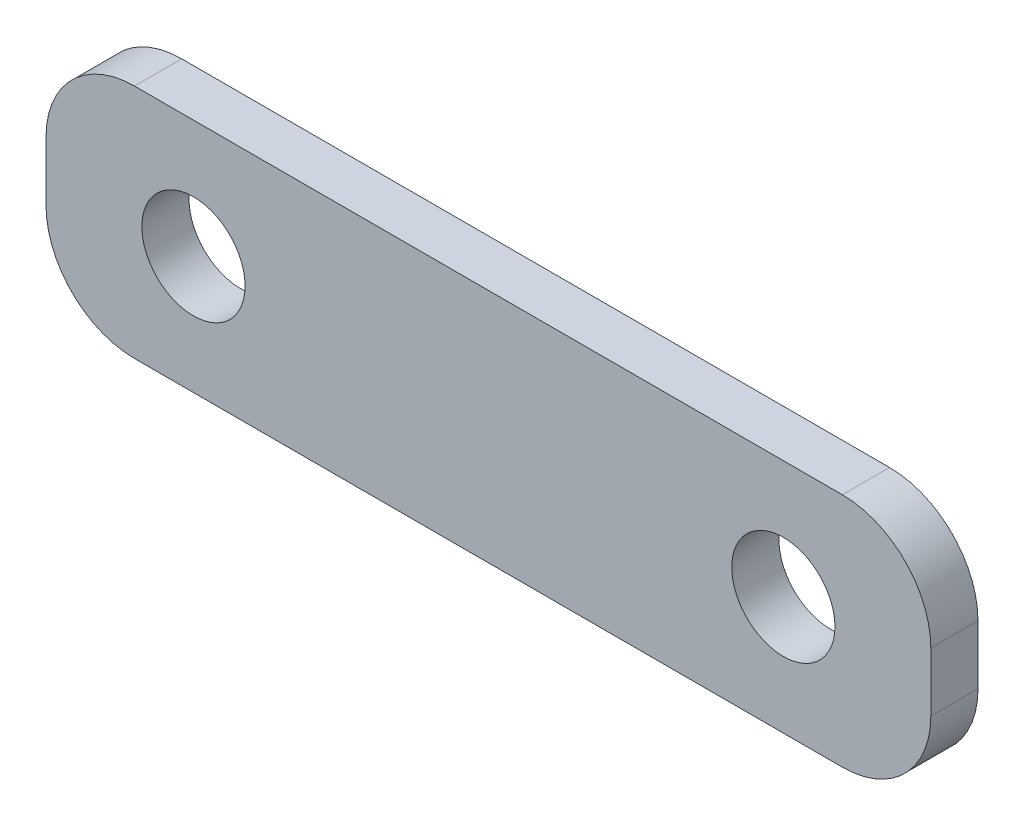
ISO-10303-21;
HEADER;
FILE_DESCRIPTION(('STEP AP214'),'2;1');
FILE_NAME('part.step','',(''),(''),'','','');
FILE_SCHEMA(('AUTOMOTIVE_DESIGN { 1 0 10303 214 1 1 1 1 }'));
ENDSEC;
DATA;
#1=APPLICATION_CONTEXT('core data for automotive mechanical design processes');
#2=APPLICATION_PROTOCOL_DEFINITION('international standard','automotive_design',2000,#1);
#3=PRODUCT_CONTEXT('',#1,'mechanical');
#4=PRODUCT('Part','Part','',(#3));
#5=PRODUCT_RELATED_PRODUCT_CATEGORY('part','',(#4));
#6=PRODUCT_DEFINITION_FORMATION('','',#4);
#7=PRODUCT_DEFINITION_CONTEXT('part definition',#1,'design');
#8=PRODUCT_DEFINITION('design','',#6,#7);
#9=PRODUCT_DEFINITION_SHAPE('','',#8);
#10=(LENGTH_UNIT() NAMED_UNIT(*) SI_UNIT(.MILLI.,.METRE.));
#11=(NAMED_UNIT(*) PLANE_ANGLE_UNIT() SI_UNIT($,.RADIAN.));
#12=(NAMED_UNIT(*) SI_UNIT($,.STERADIAN.) SOLID_ANGLE_UNIT());
#13=UNCERTAINTY_MEASURE_WITH_UNIT(LENGTH_MEASURE(1.E-05),#10,'distance_accuracy_value','');
#14=(GEOMETRIC_REPRESENTATION_CONTEXT(3) GLOBAL_UNCERTAINTY_ASSIGNED_CONTEXT((#13)) GLOBAL_UNIT_ASSIGNED_CONTEXT((#10,
#11,#12)) REPRESENTATION_CONTEXT('',''));
#15=CARTESIAN_POINT('',(0.,0.,0.));
#16=DIRECTION('',(0.,0.,1.));
#17=DIRECTION('',(1.,0.,0.));
#18=AXIS2_PLACEMENT_3D('',#15,#16,#17);
#19=CARTESIAN_POINT('',(150.,0.,4.));
#20=DIRECTION('',(0.,1.,0.));
#21=DIRECTION('',(-1.,0.,0.));
#22=AXIS2_PLACEMENT_3D('',#19,#20,#21);
#23=PLANE('',#22);
#24=DIRECTION('',(1.,0.,0.));
#25=VECTOR('',#24,1.);
#26=CARTESIAN_POINT('',(150.,0.,-4.));
#27=LINE('',#26,#25);
#28=CARTESIAN_POINT('',(15.,0.,-4.));
#29=VERTEX_POINT('',#28);
#30=CARTESIAN_POINT('',(135.,0.,-4.));
#31=VERTEX_POINT('',#30);
#32=EDGE_CURVE('E135',#29,#31,#27,.T.);
#33=ORIENTED_EDGE('',*,*,#32,.T.);
#34=DIRECTION('',(0.,0.,-1.));
#35=VECTOR('',#34,1.);
#36=CARTESIAN_POINT('',(135.,0.,4.));
#37=LINE('',#36,#35);
#38=CARTESIAN_POINT('',(135.,0.,4.));
#39=VERTEX_POINT('',#38);
#40=EDGE_CURVE('E110',#31,#39,#37,.F.);
#41=ORIENTED_EDGE('',*,*,#40,.T.);
#42=DIRECTION('',(1.,0.,0.));
#43=VECTOR('',#42,1.);
#44=CARTESIAN_POINT('',(150.,0.,4.));
#45=LINE('',#44,#43);
#46=CARTESIAN_POINT('',(15.,0.,4.));
#47=VERTEX_POINT('',#46);
#48=EDGE_CURVE('E148',#47,#39,#45,.T.);
#49=ORIENTED_EDGE('',*,*,#48,.F.);
#50=DIRECTION('',(0.,0.,-1.));
#51=VECTOR('',#50,1.);
#52=CARTESIAN_POINT('',(15.,0.,4.));
#53=LINE('',#52,#51);
#54=EDGE_CURVE('E116',#47,#29,#53,.T.);
#55=ORIENTED_EDGE('',*,*,#54,.T.);
#56=EDGE_LOOP('',(#33,#41,#49,#55));
#57=FACE_BOUND('',#56,.T.);
#58=ADVANCED_FACE('F39',(#57),#23,.F.);
#59=CARTESIAN_POINT('',(150.,40.,4.));
#60=DIRECTION('',(-1.,0.,0.));
#61=DIRECTION('',(0.,0.,1.));
#62=AXIS2_PLACEMENT_3D('',#59,#60,#61);
#63=PLANE('',#62);
#64=DIRECTION('',(0.,1.,0.));
#65=VECTOR('',#64,1.);
#66=CARTESIAN_POINT('',(150.,40.,4.));
#67=LINE('',#66,#65);
#68=CARTESIAN_POINT('',(150.,15.,4.));
#69=VERTEX_POINT('',#68);
#70=CARTESIAN_POINT('',(150.,25.,4.));
#71=VERTEX_POINT('',#70);
#72=EDGE_CURVE('E126',#69,#71,#67,.T.);
#73=ORIENTED_EDGE('',*,*,#72,.F.);
#74=DIRECTION('',(0.,0.,-1.));
#75=VECTOR('',#74,1.);
#76=CARTESIAN_POINT('',(150.,15.,4.));
#77=LINE('',#76,#75);
#78=CARTESIAN_POINT('',(150.,15.,-4.));
#79=VERTEX_POINT('',#78);
#80=EDGE_CURVE('E109',#69,#79,#77,.T.);
#81=ORIENTED_EDGE('',*,*,#80,.T.);
#82=DIRECTION('',(0.,1.,0.));
#83=VECTOR('',#82,1.);
#84=CARTESIAN_POINT('',(150.,40.,-4.));
#85=LINE('',#84,#83);
#86=CARTESIAN_POINT('',(150.,25.,-4.));
#87=VERTEX_POINT('',#86);
#88=EDGE_CURVE('E123',#79,#87,#85,.T.);
#89=ORIENTED_EDGE('',*,*,#88,.T.);
#90=DIRECTION('',(0.,0.,-1.));
#91=VECTOR('',#90,1.);
#92=CARTESIAN_POINT('',(150.,25.,4.));
#93=LINE('',#92,#91);
#94=EDGE_CURVE('E129',#87,#71,#93,.F.);
#95=ORIENTED_EDGE('',*,*,#94,.T.);
#96=EDGE_LOOP('',(#73,#81,#89,#95));
#97=FACE_BOUND('',#96,.T.);
#98=ADVANCED_FACE('F122',(#97),#63,.F.);
#99=CARTESIAN_POINT('',(0.,40.,4.));
#100=DIRECTION('',(0.,-1.,0.));
#101=DIRECTION('',(0.,0.,-1.));
#102=AXIS2_PLACEMENT_3D('',#99,#100,#101);
#103=PLANE('',#102);
#104=DIRECTION('',(-1.,0.,0.));
#105=VECTOR('',#104,1.);
#106=CARTESIAN_POINT('',(0.,40.,4.));
#107=LINE('',#106,#105);
#108=CARTESIAN_POINT('',(135.,40.,4.));
#109=VERTEX_POINT('',#108);
#110=CARTESIAN_POINT('',(15.,40.,4.));
#111=VERTEX_POINT('',#110);
#112=EDGE_CURVE('E197',#109,#111,#107,.T.);
#113=ORIENTED_EDGE('',*,*,#112,.F.);
#114=DIRECTION('',(0.,0.,-1.));
#115=VECTOR('',#114,1.);
#116=CARTESIAN_POINT('',(135.,40.,4.));
#117=LINE('',#116,#115);
#118=CARTESIAN_POINT('',(135.,40.,-4.));
#119=VERTEX_POINT('',#118);
#120=EDGE_CURVE('E178',#109,#119,#117,.T.);
#121=ORIENTED_EDGE('',*,*,#120,.T.);
#122=DIRECTION('',(-1.,0.,0.));
#123=VECTOR('',#122,1.);
#124=CARTESIAN_POINT('',(0.,40.,-4.));
#125=LINE('',#124,#123);
#126=CARTESIAN_POINT('',(15.,40.,-4.));
#127=VERTEX_POINT('',#126);
#128=EDGE_CURVE('E134',#119,#127,#125,.T.);
#129=ORIENTED_EDGE('',*,*,#128,.T.);
#130=DIRECTION('',(0.,0.,-1.));
#131=VECTOR('',#130,1.);
#132=CARTESIAN_POINT('',(15.,40.,4.));
#133=LINE('',#132,#131);
#134=EDGE_CURVE('E175',#127,#111,#133,.F.);
#135=ORIENTED_EDGE('',*,*,#134,.T.);
#136=EDGE_LOOP('',(#113,#121,#129,#135));
#137=FACE_BOUND('',#136,.T.);
#138=ADVANCED_FACE('F214',(#137),#103,.F.);
#139=CARTESIAN_POINT('',(0.,0.,4.));
#140=DIRECTION('',(1.,0.,0.));
#141=DIRECTION('',(0.,0.,-1.));
#142=AXIS2_PLACEMENT_3D('',#139,#140,#141);
#143=PLANE('',#142);
#144=DIRECTION('',(0.,-1.,0.));
#145=VECTOR('',#144,1.);
#146=CARTESIAN_POINT('',(0.,0.,-4.));
#147=LINE('',#146,#145);
#148=CARTESIAN_POINT('',(0.,25.,-4.));
#149=VERTEX_POINT('',#148);
#150=CARTESIAN_POINT('',(0.,15.,-4.));
#151=VERTEX_POINT('',#150);
#152=EDGE_CURVE('E140',#149,#151,#147,.T.);
#153=ORIENTED_EDGE('',*,*,#152,.T.);
#154=DIRECTION('',(0.,0.,-1.));
#155=VECTOR('',#154,1.);
#156=CARTESIAN_POINT('',(0.,15.,4.));
#157=LINE('',#156,#155);
#158=CARTESIAN_POINT('',(0.,15.,4.));
#159=VERTEX_POINT('',#158);
#160=EDGE_CURVE('E11',#151,#159,#157,.F.);
#161=ORIENTED_EDGE('',*,*,#160,.T.);
#162=DIRECTION('',(0.,-1.,0.));
#163=VECTOR('',#162,1.);
#164=CARTESIAN_POINT('',(0.,0.,4.));
#165=LINE('',#164,#163);
#166=CARTESIAN_POINT('',(0.,25.,4.));
#167=VERTEX_POINT('',#166);
#168=EDGE_CURVE('E150',#167,#159,#165,.T.);
#169=ORIENTED_EDGE('',*,*,#168,.F.);
#170=DIRECTION('',(0.,0.,-1.));
#171=VECTOR('',#170,1.);
#172=CARTESIAN_POINT('',(0.,25.,4.));
#173=LINE('',#172,#171);
#174=EDGE_CURVE('E48',#167,#149,#173,.T.);
#175=ORIENTED_EDGE('',*,*,#174,.T.);
#176=EDGE_LOOP('',(#153,#161,#169,#175));
#177=FACE_BOUND('',#176,.T.);
#178=ADVANCED_FACE('F185',(#177),#143,.F.);
#179=CARTESIAN_POINT('',(0.,0.,4.));
#180=DIRECTION('',(0.,0.,-1.));
#181=DIRECTION('',(-1.,0.,0.));
#182=AXIS2_PLACEMENT_3D('',#179,#180,#181);
#183=PLANE('',#182);
#184=CARTESIAN_POINT('',(25.,20.,4.));
#185=DIRECTION('',(0.,0.,1.));
#186=DIRECTION('',(1.,0.,0.));
#187=AXIS2_PLACEMENT_3D('',#184,#185,#186);
#188=CIRCLE('',#187,8.75);
#189=CARTESIAN_POINT('',(33.75,20.,4.));
#190=VERTEX_POINT('',#189);
#191=EDGE_CURVE('E310',#190,#190,#188,.T.);
#192=ORIENTED_EDGE('',*,*,#191,.F.);
#193=EDGE_LOOP('',(#192));
#194=FACE_BOUND('',#193,.T.);
#195=CARTESIAN_POINT('',(125.,20.,4.));
#196=DIRECTION('',(0.,0.,1.));
#197=DIRECTION('',(1.,0.,0.));
#198=AXIS2_PLACEMENT_3D('',#195,#196,#197);
#199=CIRCLE('',#198,8.75000000000001);
#200=CARTESIAN_POINT('',(133.75,20.,4.));
#201=VERTEX_POINT('',#200);
#202=EDGE_CURVE('E314',#201,#201,#199,.T.);
#203=ORIENTED_EDGE('',*,*,#202,.F.);
#204=EDGE_LOOP('',(#203));
#205=FACE_BOUND('',#204,.T.);
#206=ORIENTED_EDGE('',*,*,#48,.T.);
#207=CARTESIAN_POINT('',(135.,15.,4.));
#208=DIRECTION('',(0.,0.,-1.));
#209=DIRECTION('',(-1.,0.,0.));
#210=AXIS2_PLACEMENT_3D('',#207,#208,#209);
#211=CIRCLE('',#210,15.);
#212=EDGE_CURVE('E172',#39,#69,#211,.F.);
#213=ORIENTED_EDGE('',*,*,#212,.T.);
#214=ORIENTED_EDGE('',*,*,#72,.T.);
#215=CARTESIAN_POINT('',(135.,25.,4.));
#216=DIRECTION('',(0.,0.,-1.));
#217=DIRECTION('',(-1.,0.,0.));
#218=AXIS2_PLACEMENT_3D('',#215,#216,#217);
#219=CIRCLE('',#218,15.);
#220=EDGE_CURVE('E169',#71,#109,#219,.F.);
#221=ORIENTED_EDGE('',*,*,#220,.T.);
#222=ORIENTED_EDGE('',*,*,#112,.T.);
#223=CARTESIAN_POINT('',(15.,25.,4.));
#224=DIRECTION('',(0.,0.,-1.));
#225=DIRECTION('',(-1.,0.,0.));
#226=AXIS2_PLACEMENT_3D('',#223,#224,#225);
#227=CIRCLE('',#226,15.);
#228=EDGE_CURVE('E60',#111,#167,#227,.F.);
#229=ORIENTED_EDGE('',*,*,#228,.T.);
#230=ORIENTED_EDGE('',*,*,#168,.T.);
#231=CARTESIAN_POINT('',(15.,15.,4.));
#232=DIRECTION('',(0.,0.,-1.));
#233=DIRECTION('',(-1.,0.,0.));
#234=AXIS2_PLACEMENT_3D('',#231,#232,#233);
#235=CIRCLE('',#234,15.);
#236=EDGE_CURVE('E166',#159,#47,#235,.F.);
#237=ORIENTED_EDGE('',*,*,#236,.T.);
#238=EDGE_LOOP('',(#206,#213,#214,#221,#222,#229,#230,#237));
#239=FACE_BOUND('',#238,.T.);
#240=ADVANCED_FACE('F204',(#194,#205,#239),#183,.F.);
#241=CARTESIAN_POINT('',(0.,0.,-4.));
#242=DIRECTION('',(0.,0.,-1.));
#243=DIRECTION('',(-1.,0.,0.));
#244=AXIS2_PLACEMENT_3D('',#241,#242,#243);
#245=PLANE('',#244);
#246=CARTESIAN_POINT('',(25.,20.,-4.));
#247=DIRECTION('',(0.,0.,1.));
#248=DIRECTION('',(1.,0.,0.));
#249=AXIS2_PLACEMENT_3D('',#246,#247,#248);
#250=CIRCLE('',#249,8.75);
#251=CARTESIAN_POINT('',(33.75,20.,-4.));
#252=VERTEX_POINT('',#251);
#253=EDGE_CURVE('E308',#252,#252,#250,.T.);
#254=ORIENTED_EDGE('',*,*,#253,.T.);
#255=EDGE_LOOP('',(#254));
#256=FACE_BOUND('',#255,.T.);
#257=CARTESIAN_POINT('',(125.,20.,-4.));
#258=DIRECTION('',(0.,0.,1.));
#259=DIRECTION('',(1.,0.,0.));
#260=AXIS2_PLACEMENT_3D('',#257,#258,#259);
#261=CIRCLE('',#260,8.75000000000001);
#262=CARTESIAN_POINT('',(133.75,20.,-4.));
#263=VERTEX_POINT('',#262);
#264=EDGE_CURVE('E142',#263,#263,#261,.T.);
#265=ORIENTED_EDGE('',*,*,#264,.T.);
#266=EDGE_LOOP('',(#265));
#267=FACE_BOUND('',#266,.T.);
#268=ORIENTED_EDGE('',*,*,#88,.F.);
#269=CARTESIAN_POINT('',(135.,15.,-4.));
#270=DIRECTION('',(0.,0.,-1.));
#271=DIRECTION('',(-1.,0.,0.));
#272=AXIS2_PLACEMENT_3D('',#269,#270,#271);
#273=CIRCLE('',#272,15.);
#274=EDGE_CURVE('E105',#79,#31,#273,.T.);
#275=ORIENTED_EDGE('',*,*,#274,.T.);
#276=ORIENTED_EDGE('',*,*,#32,.F.);
#277=CARTESIAN_POINT('',(15.,15.,-4.));
#278=DIRECTION('',(0.,0.,-1.));
#279=DIRECTION('',(-1.,0.,0.));
#280=AXIS2_PLACEMENT_3D('',#277,#278,#279);
#281=CIRCLE('',#280,15.);
#282=EDGE_CURVE('E154',#29,#151,#281,.T.);
#283=ORIENTED_EDGE('',*,*,#282,.T.);
#284=ORIENTED_EDGE('',*,*,#152,.F.);
#285=CARTESIAN_POINT('',(15.,25.,-4.));
#286=DIRECTION('',(0.,0.,-1.));
#287=DIRECTION('',(-1.,0.,0.));
#288=AXIS2_PLACEMENT_3D('',#285,#286,#287);
#289=CIRCLE('',#288,15.);
#290=EDGE_CURVE('E128',#149,#127,#289,.T.);
#291=ORIENTED_EDGE('',*,*,#290,.T.);
#292=ORIENTED_EDGE('',*,*,#128,.F.);
#293=CARTESIAN_POINT('',(135.,25.,-4.));
#294=DIRECTION('',(0.,0.,-1.));
#295=DIRECTION('',(-1.,0.,0.));
#296=AXIS2_PLACEMENT_3D('',#293,#294,#295);
#297=CIRCLE('',#296,15.);
#298=EDGE_CURVE('E117',#119,#87,#297,.T.);
#299=ORIENTED_EDGE('',*,*,#298,.T.);
#300=EDGE_LOOP('',(#268,#275,#276,#283,#284,#291,#292,#299));
#301=FACE_BOUND('',#300,.T.);
#302=ADVANCED_FACE('F131',(#256,#267,#301),#245,.T.);
#303=CARTESIAN_POINT('',(135.,15.,4.));
#304=DIRECTION('',(0.,0.,-1.));
#305=DIRECTION('',(-1.,0.,0.));
#306=AXIS2_PLACEMENT_3D('',#303,#304,#305);
#307=CYLINDRICAL_SURFACE('',#306,15.);
#308=ORIENTED_EDGE('',*,*,#212,.F.);
#309=ORIENTED_EDGE('',*,*,#40,.F.);
#310=ORIENTED_EDGE('',*,*,#274,.F.);
#311=ORIENTED_EDGE('',*,*,#80,.F.);
#312=EDGE_LOOP('',(#308,#309,#310,#311));
#313=FACE_BOUND('',#312,.T.);
#314=ADVANCED_FACE('F108',(#313),#307,.T.);
#315=CARTESIAN_POINT('',(135.,25.,4.));
#316=DIRECTION('',(0.,0.,-1.));
#317=DIRECTION('',(-1.,0.,0.));
#318=AXIS2_PLACEMENT_3D('',#315,#316,#317);
#319=CYLINDRICAL_SURFACE('',#318,15.);
#320=ORIENTED_EDGE('',*,*,#220,.F.);
#321=ORIENTED_EDGE('',*,*,#94,.F.);
#322=ORIENTED_EDGE('',*,*,#298,.F.);
#323=ORIENTED_EDGE('',*,*,#120,.F.);
#324=EDGE_LOOP('',(#320,#321,#322,#323));
#325=FACE_BOUND('',#324,.T.);
#326=ADVANCED_FACE('F229',(#325),#319,.T.);
#327=CARTESIAN_POINT('',(15.,15.,4.));
#328=DIRECTION('',(0.,0.,-1.));
#329=DIRECTION('',(-1.,0.,0.));
#330=AXIS2_PLACEMENT_3D('',#327,#328,#329);
#331=CYLINDRICAL_SURFACE('',#330,15.);
#332=ORIENTED_EDGE('',*,*,#236,.F.);
#333=ORIENTED_EDGE('',*,*,#160,.F.);
#334=ORIENTED_EDGE('',*,*,#282,.F.);
#335=ORIENTED_EDGE('',*,*,#54,.F.);
#336=EDGE_LOOP('',(#332,#333,#334,#335));
#337=FACE_BOUND('',#336,.T.);
#338=ADVANCED_FACE('F190',(#337),#331,.T.);
#339=CARTESIAN_POINT('',(15.,25.,4.));
#340=DIRECTION('',(0.,0.,-1.));
#341=DIRECTION('',(-1.,0.,0.));
#342=AXIS2_PLACEMENT_3D('',#339,#340,#341);
#343=CYLINDRICAL_SURFACE('',#342,15.);
#344=ORIENTED_EDGE('',*,*,#228,.F.);
#345=ORIENTED_EDGE('',*,*,#134,.F.);
#346=ORIENTED_EDGE('',*,*,#290,.F.);
#347=ORIENTED_EDGE('',*,*,#174,.F.);
#348=EDGE_LOOP('',(#344,#345,#346,#347));
#349=FACE_BOUND('',#348,.T.);
#350=ADVANCED_FACE('F41',(#349),#343,.T.);
#351=CARTESIAN_POINT('',(125.,20.,4.));
#352=DIRECTION('',(0.,0.,1.));
#353=DIRECTION('',(1.,0.,0.));
#354=AXIS2_PLACEMENT_3D('',#351,#352,#353);
#355=CYLINDRICAL_SURFACE('',#354,8.75000000000001);
#356=ORIENTED_EDGE('',*,*,#264,.F.);
#357=EDGE_LOOP('',(#356));
#358=FACE_BOUND('',#357,.T.);
#359=ORIENTED_EDGE('',*,*,#202,.T.);
#360=EDGE_LOOP('',(#359));
#361=FACE_BOUND('',#360,.T.);
#362=ADVANCED_FACE('F236',(#358,#361),#355,.F.);
#363=CARTESIAN_POINT('',(25.,20.,4.));
#364=DIRECTION('',(0.,0.,1.));
#365=DIRECTION('',(1.,0.,0.));
#366=AXIS2_PLACEMENT_3D('',#363,#364,#365);
#367=CYLINDRICAL_SURFACE('',#366,8.75);
#368=ORIENTED_EDGE('',*,*,#253,.F.);
#369=EDGE_LOOP('',(#368));
#370=FACE_BOUND('',#369,.T.);
#371=ORIENTED_EDGE('',*,*,#191,.T.);
#372=EDGE_LOOP('',(#371));
#373=FACE_BOUND('',#372,.T.);
#374=ADVANCED_FACE('F240',(#370,#373),#367,.F.);
#375=CLOSED_SHELL('',(#58,#98,#138,#178,#240,#302,#314,#326,#338,#350,#362,#374));
#376=MANIFOLD_SOLID_BREP('B2',#375);
#377=ADVANCED_BREP_SHAPE_REPRESENTATION('',(#18,#376),#14);
#378=SHAPE_DEFINITION_REPRESENTATION(#9,#377);
ENDSEC;
END-ISO-10303-21;
